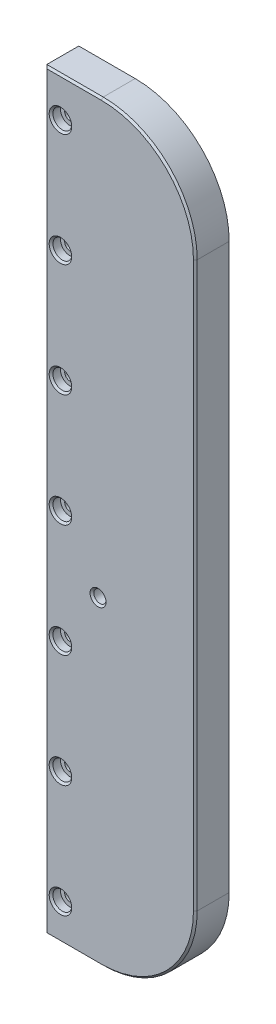
ISO-10303-21;
HEADER;
FILE_DESCRIPTION(('STEP AP214'),'2;1');
FILE_NAME('part.step','',(''),(''),'','','');
FILE_SCHEMA(('AUTOMOTIVE_DESIGN { 1 0 10303 214 1 1 1 1 }'));
ENDSEC;
DATA;
#1=APPLICATION_CONTEXT('core data for automotive mechanical design processes');
#2=APPLICATION_PROTOCOL_DEFINITION('international standard','automotive_design',2000,#1);
#3=PRODUCT_CONTEXT('',#1,'mechanical');
#4=PRODUCT('Part','Part','',(#3));
#5=PRODUCT_RELATED_PRODUCT_CATEGORY('part','',(#4));
#6=PRODUCT_DEFINITION_FORMATION('','',#4);
#7=PRODUCT_DEFINITION_CONTEXT('part definition',#1,'design');
#8=PRODUCT_DEFINITION('design','',#6,#7);
#9=PRODUCT_DEFINITION_SHAPE('','',#8);
#10=(LENGTH_UNIT() NAMED_UNIT(*) SI_UNIT(.MILLI.,.METRE.));
#11=(NAMED_UNIT(*) PLANE_ANGLE_UNIT() SI_UNIT($,.RADIAN.));
#12=(NAMED_UNIT(*) SI_UNIT($,.STERADIAN.) SOLID_ANGLE_UNIT());
#13=UNCERTAINTY_MEASURE_WITH_UNIT(LENGTH_MEASURE(1.E-05),#10,'distance_accuracy_value','');
#14=(GEOMETRIC_REPRESENTATION_CONTEXT(3) GLOBAL_UNCERTAINTY_ASSIGNED_CONTEXT((#13)) GLOBAL_UNIT_ASSIGNED_CONTEXT((#10,
#11,#12)) REPRESENTATION_CONTEXT('',''));
#15=CARTESIAN_POINT('',(0.,0.,0.));
#16=DIRECTION('',(0.,0.,1.));
#17=DIRECTION('',(1.,0.,0.));
#18=AXIS2_PLACEMENT_3D('',#15,#16,#17);
#19=CARTESIAN_POINT('',(1.00000000000003,271.,18.));
#20=DIRECTION('',(1.,0.,0.));
#21=DIRECTION('',(0.,1.,0.));
#22=AXIS2_PLACEMENT_3D('',#19,#20,#21);
#23=PLANE('',#22);
#24=DIRECTION('',(0.,0.,-1.));
#25=VECTOR('',#24,1.);
#26=CARTESIAN_POINT('',(1.00000000000008,-129.,18.));
#27=LINE('',#26,#25);
#28=CARTESIAN_POINT('',(1.00000000000008,-129.,17.0000000000001));
#29=VERTEX_POINT('',#28);
#30=CARTESIAN_POINT('',(1.00000000000008,-129.,0.));
#31=VERTEX_POINT('',#30);
#32=EDGE_CURVE('E109',#29,#31,#27,.T.);
#33=ORIENTED_EDGE('',*,*,#32,.F.);
#34=DIRECTION('',(0.,1.,0.));
#35=VECTOR('',#34,1.);
#36=CARTESIAN_POINT('',(1.00000000000003,271.,17.0000000000001));
#37=LINE('',#36,#35);
#38=CARTESIAN_POINT('',(1.00000000000003,271.,17.0000000000001));
#39=VERTEX_POINT('',#38);
#40=EDGE_CURVE('E225',#29,#39,#37,.T.);
#41=ORIENTED_EDGE('',*,*,#40,.T.);
#42=DIRECTION('',(0.,0.,-1.));
#43=VECTOR('',#42,1.);
#44=CARTESIAN_POINT('',(1.00000000000003,271.,18.));
#45=LINE('',#44,#43);
#46=CARTESIAN_POINT('',(1.00000000000003,271.,0.));
#47=VERTEX_POINT('',#46);
#48=EDGE_CURVE('E121',#39,#47,#45,.T.);
#49=ORIENTED_EDGE('',*,*,#48,.T.);
#50=DIRECTION('',(0.,-1.,0.));
#51=VECTOR('',#50,1.);
#52=CARTESIAN_POINT('',(1.00000000000003,271.,0.));
#53=LINE('',#52,#51);
#54=EDGE_CURVE('E127',#47,#31,#53,.T.);
#55=ORIENTED_EDGE('',*,*,#54,.T.);
#56=EDGE_LOOP('',(#33,#41,#49,#55));
#57=FACE_BOUND('',#56,.T.);
#58=ADVANCED_FACE('F35',(#57),#23,.F.);
#59=CARTESIAN_POINT('',(1.00000000000008,-129.,18.));
#60=DIRECTION('',(0.,1.,0.));
#61=DIRECTION('',(0.,0.,1.));
#62=AXIS2_PLACEMENT_3D('',#59,#60,#61);
#63=PLANE('',#62);
#64=DIRECTION('',(0.,0.,-1.));
#65=VECTOR('',#64,1.);
#66=CARTESIAN_POINT('',(31.0000000000001,-129.,18.));
#67=LINE('',#66,#65);
#68=CARTESIAN_POINT('',(31.0000000000001,-129.,0.));
#69=VERTEX_POINT('',#68);
#70=CARTESIAN_POINT('',(31.0000000000001,-129.,17.0000000000001));
#71=VERTEX_POINT('',#70);
#72=EDGE_CURVE('E155',#69,#71,#67,.F.);
#73=ORIENTED_EDGE('',*,*,#72,.T.);
#74=DIRECTION('',(-1.,0.,0.));
#75=VECTOR('',#74,1.);
#76=CARTESIAN_POINT('',(1.00000000000008,-129.,17.0000000000001));
#77=LINE('',#76,#75);
#78=EDGE_CURVE('E116',#71,#29,#77,.T.);
#79=ORIENTED_EDGE('',*,*,#78,.T.);
#80=ORIENTED_EDGE('',*,*,#32,.T.);
#81=DIRECTION('',(1.,0.,0.));
#82=VECTOR('',#81,1.);
#83=CARTESIAN_POINT('',(1.00000000000008,-129.,0.));
#84=LINE('',#83,#82);
#85=EDGE_CURVE('E113',#31,#69,#84,.T.);
#86=ORIENTED_EDGE('',*,*,#85,.T.);
#87=EDGE_LOOP('',(#73,#79,#80,#86));
#88=FACE_BOUND('',#87,.T.);
#89=ADVANCED_FACE('F112',(#88),#63,.F.);
#90=CARTESIAN_POINT('',(81.,271.,18.));
#91=DIRECTION('',(-1.,0.,0.));
#92=DIRECTION('',(0.,-1.,0.));
#93=AXIS2_PLACEMENT_3D('',#90,#91,#92);
#94=PLANE('',#93);
#95=DIRECTION('',(0.,0.,-1.));
#96=VECTOR('',#95,1.);
#97=CARTESIAN_POINT('',(81.,221.,18.));
#98=LINE('',#97,#96);
#99=CARTESIAN_POINT('',(81.,221.,0.));
#100=VERTEX_POINT('',#99);
#101=CARTESIAN_POINT('',(81.,221.,17.0000000000001));
#102=VERTEX_POINT('',#101);
#103=EDGE_CURVE('E153',#100,#102,#98,.F.);
#104=ORIENTED_EDGE('',*,*,#103,.T.);
#105=DIRECTION('',(0.,-1.,0.));
#106=VECTOR('',#105,1.);
#107=CARTESIAN_POINT('',(81.0000000000001,-78.9999999999998,17.0000000000001));
#108=LINE('',#107,#106);
#109=CARTESIAN_POINT('',(81.0000000000001,-78.9999999999998,17.0000000000001));
#110=VERTEX_POINT('',#109);
#111=EDGE_CURVE('E229',#102,#110,#108,.T.);
#112=ORIENTED_EDGE('',*,*,#111,.T.);
#113=DIRECTION('',(0.,0.,-1.));
#114=VECTOR('',#113,1.);
#115=CARTESIAN_POINT('',(81.0000000000001,-78.9999999999998,18.));
#116=LINE('',#115,#114);
#117=CARTESIAN_POINT('',(81.0000000000001,-78.9999999999998,0.));
#118=VERTEX_POINT('',#117);
#119=EDGE_CURVE('E151',#110,#118,#116,.T.);
#120=ORIENTED_EDGE('',*,*,#119,.T.);
#121=DIRECTION('',(0.,1.,0.));
#122=VECTOR('',#121,1.);
#123=CARTESIAN_POINT('',(81.,271.,0.));
#124=LINE('',#123,#122);
#125=EDGE_CURVE('E131',#118,#100,#124,.T.);
#126=ORIENTED_EDGE('',*,*,#125,.T.);
#127=EDGE_LOOP('',(#104,#112,#120,#126));
#128=FACE_BOUND('',#127,.T.);
#129=ADVANCED_FACE('F326',(#128),#94,.F.);
#130=CARTESIAN_POINT('',(1.00000000000003,271.,18.));
#131=DIRECTION('',(0.,-1.,0.));
#132=DIRECTION('',(0.,0.,-1.));
#133=AXIS2_PLACEMENT_3D('',#130,#131,#132);
#134=PLANE('',#133);
#135=ORIENTED_EDGE('',*,*,#48,.F.);
#136=DIRECTION('',(1.,0.,0.));
#137=VECTOR('',#136,1.);
#138=CARTESIAN_POINT('',(31.,271.,17.0000000000001));
#139=LINE('',#138,#137);
#140=CARTESIAN_POINT('',(31.,271.,17.0000000000001));
#141=VERTEX_POINT('',#140);
#142=EDGE_CURVE('E59',#39,#141,#139,.T.);
#143=ORIENTED_EDGE('',*,*,#142,.T.);
#144=DIRECTION('',(0.,0.,-1.));
#145=VECTOR('',#144,1.);
#146=CARTESIAN_POINT('',(31.,271.,18.));
#147=LINE('',#146,#145);
#148=CARTESIAN_POINT('',(31.,271.,0.));
#149=VERTEX_POINT('',#148);
#150=EDGE_CURVE('E120',#141,#149,#147,.T.);
#151=ORIENTED_EDGE('',*,*,#150,.T.);
#152=DIRECTION('',(-1.,0.,0.));
#153=VECTOR('',#152,1.);
#154=CARTESIAN_POINT('',(1.00000000000003,271.,0.));
#155=LINE('',#154,#153);
#156=EDGE_CURVE('E144',#149,#47,#155,.T.);
#157=ORIENTED_EDGE('',*,*,#156,.T.);
#158=EDGE_LOOP('',(#135,#143,#151,#157));
#159=FACE_BOUND('',#158,.T.);
#160=ADVANCED_FACE('F616',(#159),#134,.F.);
#161=CARTESIAN_POINT('',(0.,0.,18.));
#162=DIRECTION('',(0.,0.,1.));
#163=DIRECTION('',(1.,0.,0.));
#164=AXIS2_PLACEMENT_3D('',#161,#162,#163);
#165=PLANE('',#164);
#166=CARTESIAN_POINT('',(29.2499999999996,40.0000000000003,18.));
#167=DIRECTION('',(0.,0.,1.));
#168=DIRECTION('',(1.,0.,0.));
#169=AXIS2_PLACEMENT_3D('',#166,#167,#168);
#170=CIRCLE('',#169,4.24999999999998);
#171=CARTESIAN_POINT('',(33.4999999999996,40.0000000000003,18.));
#172=VERTEX_POINT('',#171);
#173=EDGE_CURVE('E11',#172,#172,#170,.F.);
#174=ORIENTED_EDGE('',*,*,#173,.T.);
#175=EDGE_LOOP('',(#174));
#176=FACE_BOUND('',#175,.T.);
#177=DIRECTION('',(1.,0.,0.));
#178=VECTOR('',#177,1.);
#179=CARTESIAN_POINT('',(31.0000000000001,-128.,18.));
#180=LINE('',#179,#178);
#181=CARTESIAN_POINT('',(2.00000000000003,-128.,18.));
#182=VERTEX_POINT('',#181);
#183=CARTESIAN_POINT('',(31.0000000000001,-128.,18.));
#184=VERTEX_POINT('',#183);
#185=EDGE_CURVE('E216',#182,#184,#180,.T.);
#186=ORIENTED_EDGE('',*,*,#185,.T.);
#187=CARTESIAN_POINT('',(31.0000000000001,-78.9999999999998,18.));
#188=DIRECTION('',(0.,0.,1.));
#189=DIRECTION('',(1.,0.,0.));
#190=AXIS2_PLACEMENT_3D('',#187,#188,#189);
#191=CIRCLE('',#190,49.);
#192=CARTESIAN_POINT('',(80.0000000000001,-78.9999999999998,18.));
#193=VERTEX_POINT('',#192);
#194=EDGE_CURVE('E218',#184,#193,#191,.T.);
#195=ORIENTED_EDGE('',*,*,#194,.T.);
#196=DIRECTION('',(0.,1.,0.));
#197=VECTOR('',#196,1.);
#198=CARTESIAN_POINT('',(80.0000000000001,221.,18.));
#199=LINE('',#198,#197);
#200=CARTESIAN_POINT('',(80.0000000000001,221.,18.));
#201=VERTEX_POINT('',#200);
#202=EDGE_CURVE('E208',#193,#201,#199,.T.);
#203=ORIENTED_EDGE('',*,*,#202,.T.);
#204=CARTESIAN_POINT('',(31.,221.,18.));
#205=DIRECTION('',(0.,0.,1.));
#206=DIRECTION('',(1.,0.,0.));
#207=AXIS2_PLACEMENT_3D('',#204,#205,#206);
#208=CIRCLE('',#207,49.);
#209=CARTESIAN_POINT('',(31.,270.,18.));
#210=VERTEX_POINT('',#209);
#211=EDGE_CURVE('E210',#201,#210,#208,.T.);
#212=ORIENTED_EDGE('',*,*,#211,.T.);
#213=DIRECTION('',(-1.,0.,0.));
#214=VECTOR('',#213,1.);
#215=CARTESIAN_POINT('',(1.00000000000003,270.,18.));
#216=LINE('',#215,#214);
#217=CARTESIAN_POINT('',(1.99999999999998,270.,18.));
#218=VERTEX_POINT('',#217);
#219=EDGE_CURVE('E212',#210,#218,#216,.T.);
#220=ORIENTED_EDGE('',*,*,#219,.T.);
#221=DIRECTION('',(0.,-1.,0.));
#222=VECTOR('',#221,1.);
#223=CARTESIAN_POINT('',(2.00000000000003,-129.,18.));
#224=LINE('',#223,#222);
#225=EDGE_CURVE('E214',#218,#182,#224,.T.);
#226=ORIENTED_EDGE('',*,*,#225,.T.);
#227=EDGE_LOOP('',(#186,#195,#203,#212,#220,#226));
#228=FACE_BOUND('',#227,.T.);
#229=CARTESIAN_POINT('',(9.24999999999879,250.,18.));
#230=DIRECTION('',(0.,0.,1.));
#231=DIRECTION('',(1.,0.,0.));
#232=AXIS2_PLACEMENT_3D('',#229,#230,#231);
#233=CIRCLE('',#232,6.00000000000001);
#234=CARTESIAN_POINT('',(15.2499999999988,250.,18.));
#235=VERTEX_POINT('',#234);
#236=EDGE_CURVE('E205',#235,#235,#233,.F.);
#237=ORIENTED_EDGE('',*,*,#236,.T.);
#238=EDGE_LOOP('',(#237));
#239=FACE_BOUND('',#238,.T.);
#240=CARTESIAN_POINT('',(9.25000000000003,-110.,18.));
#241=DIRECTION('',(0.,0.,1.));
#242=DIRECTION('',(1.,0.,0.));
#243=AXIS2_PLACEMENT_3D('',#240,#241,#242);
#244=CIRCLE('',#243,6.00000000000001);
#245=CARTESIAN_POINT('',(15.25,-110.,18.));
#246=VERTEX_POINT('',#245);
#247=EDGE_CURVE('E202',#246,#246,#244,.F.);
#248=ORIENTED_EDGE('',*,*,#247,.T.);
#249=EDGE_LOOP('',(#248));
#250=FACE_BOUND('',#249,.T.);
#251=CARTESIAN_POINT('',(9.24999999999982,-49.9999999999997,18.));
#252=DIRECTION('',(0.,0.,1.));
#253=DIRECTION('',(1.,0.,0.));
#254=AXIS2_PLACEMENT_3D('',#251,#252,#253);
#255=CIRCLE('',#254,6.00000000000001);
#256=CARTESIAN_POINT('',(15.2499999999998,-49.9999999999997,18.));
#257=VERTEX_POINT('',#256);
#258=EDGE_CURVE('E199',#257,#257,#255,.F.);
#259=ORIENTED_EDGE('',*,*,#258,.T.);
#260=EDGE_LOOP('',(#259));
#261=FACE_BOUND('',#260,.T.);
#262=CARTESIAN_POINT('',(9.24999999999962,10.0000000000003,18.));
#263=DIRECTION('',(0.,0.,1.));
#264=DIRECTION('',(1.,0.,0.));
#265=AXIS2_PLACEMENT_3D('',#262,#263,#264);
#266=CIRCLE('',#265,5.99999999999995);
#267=CARTESIAN_POINT('',(15.2499999999996,10.0000000000003,18.));
#268=VERTEX_POINT('',#267);
#269=EDGE_CURVE('E196',#268,#268,#266,.F.);
#270=ORIENTED_EDGE('',*,*,#269,.T.);
#271=EDGE_LOOP('',(#270));
#272=FACE_BOUND('',#271,.T.);
#273=CARTESIAN_POINT('',(9.24999999999941,70.0000000000003,18.));
#274=DIRECTION('',(0.,0.,1.));
#275=DIRECTION('',(1.,0.,0.));
#276=AXIS2_PLACEMENT_3D('',#273,#274,#275);
#277=CIRCLE('',#276,6.00000000000001);
#278=CARTESIAN_POINT('',(15.2499999999994,70.0000000000003,18.));
#279=VERTEX_POINT('',#278);
#280=EDGE_CURVE('E193',#279,#279,#277,.F.);
#281=ORIENTED_EDGE('',*,*,#280,.T.);
#282=EDGE_LOOP('',(#281));
#283=FACE_BOUND('',#282,.T.);
#284=CARTESIAN_POINT('',(9.2499999999992,130.,18.));
#285=DIRECTION('',(0.,0.,1.));
#286=DIRECTION('',(1.,0.,0.));
#287=AXIS2_PLACEMENT_3D('',#284,#285,#286);
#288=CIRCLE('',#287,6.00000000000001);
#289=CARTESIAN_POINT('',(15.2499999999992,130.,18.));
#290=VERTEX_POINT('',#289);
#291=EDGE_CURVE('E190',#290,#290,#288,.F.);
#292=ORIENTED_EDGE('',*,*,#291,.T.);
#293=EDGE_LOOP('',(#292));
#294=FACE_BOUND('',#293,.T.);
#295=CARTESIAN_POINT('',(9.249999999999,190.,18.));
#296=DIRECTION('',(0.,0.,1.));
#297=DIRECTION('',(1.,0.,0.));
#298=AXIS2_PLACEMENT_3D('',#295,#296,#297);
#299=CIRCLE('',#298,6.00000000000001);
#300=CARTESIAN_POINT('',(15.249999999999,190.,18.));
#301=VERTEX_POINT('',#300);
#302=EDGE_CURVE('E156',#301,#301,#299,.F.);
#303=ORIENTED_EDGE('',*,*,#302,.T.);
#304=EDGE_LOOP('',(#303));
#305=FACE_BOUND('',#304,.T.);
#306=ADVANCED_FACE('F288',(#176,#228,#239,#250,#261,#272,#283,#294,#305),#165,.T.);
#307=CARTESIAN_POINT('',(0.,0.,0.));
#308=DIRECTION('',(0.,0.,1.));
#309=DIRECTION('',(1.,0.,0.));
#310=AXIS2_PLACEMENT_3D('',#307,#308,#309);
#311=PLANE('',#310);
#312=CARTESIAN_POINT('',(29.2499999999996,40.0000000000003,0.));
#313=DIRECTION('',(0.,0.,1.));
#314=DIRECTION('',(1.,0.,0.));
#315=AXIS2_PLACEMENT_3D('',#312,#313,#314);
#316=CIRCLE('',#315,4.24999999999998);
#317=CARTESIAN_POINT('',(33.4999999999996,40.0000000000003,0.));
#318=VERTEX_POINT('',#317);
#319=EDGE_CURVE('E252',#318,#318,#316,.T.);
#320=ORIENTED_EDGE('',*,*,#319,.T.);
#321=EDGE_LOOP('',(#320));
#322=FACE_BOUND('',#321,.T.);
#323=CARTESIAN_POINT('',(9.249999999999,190.,0.));
#324=DIRECTION('',(0.,0.,1.));
#325=DIRECTION('',(1.,0.,0.));
#326=AXIS2_PLACEMENT_3D('',#323,#324,#325);
#327=CIRCLE('',#326,2.74999999999999);
#328=CARTESIAN_POINT('',(11.999999999999,190.,0.));
#329=VERTEX_POINT('',#328);
#330=EDGE_CURVE('E183',#329,#329,#327,.T.);
#331=ORIENTED_EDGE('',*,*,#330,.T.);
#332=EDGE_LOOP('',(#331));
#333=FACE_BOUND('',#332,.T.);
#334=CARTESIAN_POINT('',(9.2499999999992,130.,0.));
#335=DIRECTION('',(0.,0.,1.));
#336=DIRECTION('',(1.,0.,0.));
#337=AXIS2_PLACEMENT_3D('',#334,#335,#336);
#338=CIRCLE('',#337,2.74999999999999);
#339=CARTESIAN_POINT('',(11.9999999999992,130.,0.));
#340=VERTEX_POINT('',#339);
#341=EDGE_CURVE('E178',#340,#340,#338,.T.);
#342=ORIENTED_EDGE('',*,*,#341,.T.);
#343=EDGE_LOOP('',(#342));
#344=FACE_BOUND('',#343,.T.);
#345=CARTESIAN_POINT('',(9.24999999999941,70.0000000000003,0.));
#346=DIRECTION('',(0.,0.,1.));
#347=DIRECTION('',(1.,0.,0.));
#348=AXIS2_PLACEMENT_3D('',#345,#346,#347);
#349=CIRCLE('',#348,2.74999999999999);
#350=CARTESIAN_POINT('',(11.9999999999994,70.0000000000003,0.));
#351=VERTEX_POINT('',#350);
#352=EDGE_CURVE('E173',#351,#351,#349,.T.);
#353=ORIENTED_EDGE('',*,*,#352,.T.);
#354=EDGE_LOOP('',(#353));
#355=FACE_BOUND('',#354,.T.);
#356=CARTESIAN_POINT('',(9.24999999999962,10.0000000000003,0.));
#357=DIRECTION('',(0.,0.,1.));
#358=DIRECTION('',(1.,0.,0.));
#359=AXIS2_PLACEMENT_3D('',#356,#357,#358);
#360=CIRCLE('',#359,2.74999999999999);
#361=CARTESIAN_POINT('',(11.9999999999996,10.0000000000003,0.));
#362=VERTEX_POINT('',#361);
#363=EDGE_CURVE('E168',#362,#362,#360,.T.);
#364=ORIENTED_EDGE('',*,*,#363,.T.);
#365=EDGE_LOOP('',(#364));
#366=FACE_BOUND('',#365,.T.);
#367=CARTESIAN_POINT('',(9.24999999999982,-49.9999999999997,0.));
#368=DIRECTION('',(0.,0.,1.));
#369=DIRECTION('',(1.,0.,0.));
#370=AXIS2_PLACEMENT_3D('',#367,#368,#369);
#371=CIRCLE('',#370,2.74999999999999);
#372=CARTESIAN_POINT('',(11.9999999999998,-49.9999999999997,0.));
#373=VERTEX_POINT('',#372);
#374=EDGE_CURVE('E163',#373,#373,#371,.T.);
#375=ORIENTED_EDGE('',*,*,#374,.T.);
#376=EDGE_LOOP('',(#375));
#377=FACE_BOUND('',#376,.T.);
#378=CARTESIAN_POINT('',(9.25000000000003,-110.,0.));
#379=DIRECTION('',(0.,0.,1.));
#380=DIRECTION('',(1.,0.,0.));
#381=AXIS2_PLACEMENT_3D('',#378,#379,#380);
#382=CIRCLE('',#381,2.74999999999999);
#383=CARTESIAN_POINT('',(12.,-110.,0.));
#384=VERTEX_POINT('',#383);
#385=EDGE_CURVE('E158',#384,#384,#382,.T.);
#386=ORIENTED_EDGE('',*,*,#385,.T.);
#387=EDGE_LOOP('',(#386));
#388=FACE_BOUND('',#387,.T.);
#389=CARTESIAN_POINT('',(9.24999999999879,250.,0.));
#390=DIRECTION('',(0.,0.,1.));
#391=DIRECTION('',(1.,0.,0.));
#392=AXIS2_PLACEMENT_3D('',#389,#390,#391);
#393=CIRCLE('',#392,2.74999999999999);
#394=CARTESIAN_POINT('',(11.9999999999988,250.,0.));
#395=VERTEX_POINT('',#394);
#396=EDGE_CURVE('E134',#395,#395,#393,.T.);
#397=ORIENTED_EDGE('',*,*,#396,.T.);
#398=EDGE_LOOP('',(#397));
#399=FACE_BOUND('',#398,.T.);
#400=ORIENTED_EDGE('',*,*,#156,.F.);
#401=CARTESIAN_POINT('',(31.,221.,0.));
#402=DIRECTION('',(0.,0.,1.));
#403=DIRECTION('',(1.,0.,0.));
#404=AXIS2_PLACEMENT_3D('',#401,#402,#403);
#405=CIRCLE('',#404,50.);
#406=EDGE_CURVE('E149',#149,#100,#405,.F.);
#407=ORIENTED_EDGE('',*,*,#406,.T.);
#408=ORIENTED_EDGE('',*,*,#125,.F.);
#409=CARTESIAN_POINT('',(31.0000000000001,-78.9999999999998,0.));
#410=DIRECTION('',(0.,0.,1.));
#411=DIRECTION('',(1.,0.,0.));
#412=AXIS2_PLACEMENT_3D('',#409,#410,#411);
#413=CIRCLE('',#412,50.);
#414=EDGE_CURVE('E130',#118,#69,#413,.F.);
#415=ORIENTED_EDGE('',*,*,#414,.T.);
#416=ORIENTED_EDGE('',*,*,#85,.F.);
#417=ORIENTED_EDGE('',*,*,#54,.F.);
#418=EDGE_LOOP('',(#400,#407,#408,#415,#416,#417));
#419=FACE_BOUND('',#418,.T.);
#420=ADVANCED_FACE('F126',(#322,#333,#344,#355,#366,#377,#388,#399,#419),#311,.F.);
#421=CARTESIAN_POINT('',(31.,221.,18.));
#422=DIRECTION('',(0.,0.,-1.));
#423=DIRECTION('',(-1.,0.,0.));
#424=AXIS2_PLACEMENT_3D('',#421,#422,#423);
#425=CYLINDRICAL_SURFACE('',#424,50.);
#426=ORIENTED_EDGE('',*,*,#150,.F.);
#427=CARTESIAN_POINT('',(31.,221.,17.0000000000001));
#428=DIRECTION('',(0.,0.,1.));
#429=DIRECTION('',(1.,0.,0.));
#430=AXIS2_PLACEMENT_3D('',#427,#428,#429);
#431=CIRCLE('',#430,50.);
#432=EDGE_CURVE('E51',#141,#102,#431,.F.);
#433=ORIENTED_EDGE('',*,*,#432,.T.);
#434=ORIENTED_EDGE('',*,*,#103,.F.);
#435=ORIENTED_EDGE('',*,*,#406,.F.);
#436=EDGE_LOOP('',(#426,#433,#434,#435));
#437=FACE_BOUND('',#436,.T.);
#438=ADVANCED_FACE('F287',(#437),#425,.T.);
#439=CARTESIAN_POINT('',(31.0000000000001,-78.9999999999998,18.));
#440=DIRECTION('',(0.,0.,-1.));
#441=DIRECTION('',(-1.,0.,0.));
#442=AXIS2_PLACEMENT_3D('',#439,#440,#441);
#443=CYLINDRICAL_SURFACE('',#442,50.);
#444=ORIENTED_EDGE('',*,*,#119,.F.);
#445=CARTESIAN_POINT('',(31.0000000000001,-78.9999999999998,17.0000000000001));
#446=DIRECTION('',(0.,0.,1.));
#447=DIRECTION('',(1.,0.,0.));
#448=AXIS2_PLACEMENT_3D('',#445,#446,#447);
#449=CIRCLE('',#448,50.);
#450=EDGE_CURVE('E221',#110,#71,#449,.F.);
#451=ORIENTED_EDGE('',*,*,#450,.T.);
#452=ORIENTED_EDGE('',*,*,#72,.F.);
#453=ORIENTED_EDGE('',*,*,#414,.F.);
#454=EDGE_LOOP('',(#444,#451,#452,#453));
#455=FACE_BOUND('',#454,.T.);
#456=ADVANCED_FACE('F307',(#455),#443,.T.);
#457=CARTESIAN_POINT('',(9.24999999999879,250.,18.));
#458=DIRECTION('',(0.,0.,1.));
#459=DIRECTION('',(1.,0.,0.));
#460=AXIS2_PLACEMENT_3D('',#457,#458,#459);
#461=CYLINDRICAL_SURFACE('',#460,2.74999999999999);
#462=CARTESIAN_POINT('',(9.24999999999879,250.,13.));
#463=DIRECTION('',(0.,0.,1.));
#464=DIRECTION('',(1.,0.,0.));
#465=AXIS2_PLACEMENT_3D('',#462,#463,#464);
#466=CIRCLE('',#465,2.75);
#467=CARTESIAN_POINT('',(11.9999999999988,250.,13.));
#468=VERTEX_POINT('',#467);
#469=EDGE_CURVE('E137',#468,#468,#466,.T.);
#470=ORIENTED_EDGE('',*,*,#469,.T.);
#471=EDGE_LOOP('',(#470));
#472=FACE_BOUND('',#471,.T.);
#473=ORIENTED_EDGE('',*,*,#396,.F.);
#474=EDGE_LOOP('',(#473));
#475=FACE_BOUND('',#474,.T.);
#476=ADVANCED_FACE('F304',(#472,#475),#461,.F.);
#477=CARTESIAN_POINT('',(11.9999999999988,250.,13.));
#478=DIRECTION('',(0.,0.,-1.));
#479=DIRECTION('',(-1.,0.,0.));
#480=AXIS2_PLACEMENT_3D('',#477,#478,#479);
#481=PLANE('',#480);
#482=ORIENTED_EDGE('',*,*,#469,.F.);
#483=EDGE_LOOP('',(#482));
#484=FACE_BOUND('',#483,.T.);
#485=CARTESIAN_POINT('',(9.24999999999879,250.,13.));
#486=DIRECTION('',(0.,0.,1.));
#487=DIRECTION('',(1.,0.,0.));
#488=AXIS2_PLACEMENT_3D('',#485,#486,#487);
#489=CIRCLE('',#488,5.);
#490=CARTESIAN_POINT('',(14.2499999999988,250.,13.));
#491=VERTEX_POINT('',#490);
#492=EDGE_CURVE('E161',#491,#491,#489,.T.);
#493=ORIENTED_EDGE('',*,*,#492,.T.);
#494=EDGE_LOOP('',(#493));
#495=FACE_BOUND('',#494,.T.);
#496=ADVANCED_FACE('F306',(#484,#495),#481,.F.);
#497=CARTESIAN_POINT('',(9.24999999999879,250.,18.));
#498=DIRECTION('',(0.,0.,1.));
#499=DIRECTION('',(1.,0.,0.));
#500=AXIS2_PLACEMENT_3D('',#497,#498,#499);
#501=CYLINDRICAL_SURFACE('',#500,5.);
#502=CARTESIAN_POINT('',(9.24999999999879,250.,17.));
#503=DIRECTION('',(0.,0.,1.));
#504=DIRECTION('',(1.,0.,0.));
#505=AXIS2_PLACEMENT_3D('',#502,#503,#504);
#506=CIRCLE('',#505,5.);
#507=CARTESIAN_POINT('',(14.2499999999988,250.,17.));
#508=VERTEX_POINT('',#507);
#509=EDGE_CURVE('E231',#508,#508,#506,.T.);
#510=ORIENTED_EDGE('',*,*,#509,.T.);
#511=EDGE_LOOP('',(#510));
#512=FACE_BOUND('',#511,.T.);
#513=ORIENTED_EDGE('',*,*,#492,.F.);
#514=EDGE_LOOP('',(#513));
#515=FACE_BOUND('',#514,.T.);
#516=ADVANCED_FACE('F314',(#512,#515),#501,.F.);
#517=CARTESIAN_POINT('',(9.25000000000003,-110.,18.));
#518=DIRECTION('',(0.,0.,1.));
#519=DIRECTION('',(1.,0.,0.));
#520=AXIS2_PLACEMENT_3D('',#517,#518,#519);
#521=CYLINDRICAL_SURFACE('',#520,2.74999999999999);
#522=CARTESIAN_POINT('',(9.25000000000003,-110.,13.));
#523=DIRECTION('',(0.,0.,1.));
#524=DIRECTION('',(1.,0.,0.));
#525=AXIS2_PLACEMENT_3D('',#522,#523,#524);
#526=CIRCLE('',#525,2.75);
#527=CARTESIAN_POINT('',(12.,-110.,13.));
#528=VERTEX_POINT('',#527);
#529=EDGE_CURVE('E162',#528,#528,#526,.T.);
#530=ORIENTED_EDGE('',*,*,#529,.T.);
#531=EDGE_LOOP('',(#530));
#532=FACE_BOUND('',#531,.T.);
#533=ORIENTED_EDGE('',*,*,#385,.F.);
#534=EDGE_LOOP('',(#533));
#535=FACE_BOUND('',#534,.T.);
#536=ADVANCED_FACE('F472',(#532,#535),#521,.F.);
#537=CARTESIAN_POINT('',(12.,-110.,13.));
#538=DIRECTION('',(0.,0.,-1.));
#539=DIRECTION('',(-1.,0.,0.));
#540=AXIS2_PLACEMENT_3D('',#537,#538,#539);
#541=PLANE('',#540);
#542=ORIENTED_EDGE('',*,*,#529,.F.);
#543=EDGE_LOOP('',(#542));
#544=FACE_BOUND('',#543,.T.);
#545=CARTESIAN_POINT('',(9.25000000000003,-110.,13.));
#546=DIRECTION('',(0.,0.,1.));
#547=DIRECTION('',(1.,0.,0.));
#548=AXIS2_PLACEMENT_3D('',#545,#546,#547);
#549=CIRCLE('',#548,5.);
#550=CARTESIAN_POINT('',(14.25,-110.,13.));
#551=VERTEX_POINT('',#550);
#552=EDGE_CURVE('E166',#551,#551,#549,.T.);
#553=ORIENTED_EDGE('',*,*,#552,.T.);
#554=EDGE_LOOP('',(#553));
#555=FACE_BOUND('',#554,.T.);
#556=ADVANCED_FACE('F478',(#544,#555),#541,.F.);
#557=CARTESIAN_POINT('',(9.25000000000003,-110.,18.));
#558=DIRECTION('',(0.,0.,1.));
#559=DIRECTION('',(1.,0.,0.));
#560=AXIS2_PLACEMENT_3D('',#557,#558,#559);
#561=CYLINDRICAL_SURFACE('',#560,5.);
#562=CARTESIAN_POINT('',(9.25000000000003,-110.,17.));
#563=DIRECTION('',(0.,0.,1.));
#564=DIRECTION('',(1.,0.,0.));
#565=AXIS2_PLACEMENT_3D('',#562,#563,#564);
#566=CIRCLE('',#565,5.);
#567=CARTESIAN_POINT('',(14.25,-110.,17.));
#568=VERTEX_POINT('',#567);
#569=EDGE_CURVE('E234',#568,#568,#566,.T.);
#570=ORIENTED_EDGE('',*,*,#569,.T.);
#571=EDGE_LOOP('',(#570));
#572=FACE_BOUND('',#571,.T.);
#573=ORIENTED_EDGE('',*,*,#552,.F.);
#574=EDGE_LOOP('',(#573));
#575=FACE_BOUND('',#574,.T.);
#576=ADVANCED_FACE('F484',(#572,#575),#561,.F.);
#577=CARTESIAN_POINT('',(9.24999999999982,-49.9999999999997,18.));
#578=DIRECTION('',(0.,0.,1.));
#579=DIRECTION('',(1.,0.,0.));
#580=AXIS2_PLACEMENT_3D('',#577,#578,#579);
#581=CYLINDRICAL_SURFACE('',#580,2.74999999999999);
#582=CARTESIAN_POINT('',(9.24999999999982,-49.9999999999997,13.));
#583=DIRECTION('',(0.,0.,1.));
#584=DIRECTION('',(1.,0.,0.));
#585=AXIS2_PLACEMENT_3D('',#582,#583,#584);
#586=CIRCLE('',#585,2.75);
#587=CARTESIAN_POINT('',(11.9999999999998,-49.9999999999997,13.));
#588=VERTEX_POINT('',#587);
#589=EDGE_CURVE('E167',#588,#588,#586,.T.);
#590=ORIENTED_EDGE('',*,*,#589,.T.);
#591=EDGE_LOOP('',(#590));
#592=FACE_BOUND('',#591,.T.);
#593=ORIENTED_EDGE('',*,*,#374,.F.);
#594=EDGE_LOOP('',(#593));
#595=FACE_BOUND('',#594,.T.);
#596=ADVANCED_FACE('F488',(#592,#595),#581,.F.);
#597=CARTESIAN_POINT('',(11.9999999999998,-49.9999999999997,13.));
#598=DIRECTION('',(0.,0.,-1.));
#599=DIRECTION('',(-1.,0.,0.));
#600=AXIS2_PLACEMENT_3D('',#597,#598,#599);
#601=PLANE('',#600);
#602=ORIENTED_EDGE('',*,*,#589,.F.);
#603=EDGE_LOOP('',(#602));
#604=FACE_BOUND('',#603,.T.);
#605=CARTESIAN_POINT('',(9.24999999999982,-49.9999999999997,13.));
#606=DIRECTION('',(0.,0.,1.));
#607=DIRECTION('',(1.,0.,0.));
#608=AXIS2_PLACEMENT_3D('',#605,#606,#607);
#609=CIRCLE('',#608,5.);
#610=CARTESIAN_POINT('',(14.2499999999998,-49.9999999999997,13.));
#611=VERTEX_POINT('',#610);
#612=EDGE_CURVE('E171',#611,#611,#609,.T.);
#613=ORIENTED_EDGE('',*,*,#612,.T.);
#614=EDGE_LOOP('',(#613));
#615=FACE_BOUND('',#614,.T.);
#616=ADVANCED_FACE('F492',(#604,#615),#601,.F.);
#617=CARTESIAN_POINT('',(9.24999999999982,-49.9999999999997,18.));
#618=DIRECTION('',(0.,0.,1.));
#619=DIRECTION('',(1.,0.,0.));
#620=AXIS2_PLACEMENT_3D('',#617,#618,#619);
#621=CYLINDRICAL_SURFACE('',#620,5.);
#622=CARTESIAN_POINT('',(9.24999999999982,-49.9999999999997,17.));
#623=DIRECTION('',(0.,0.,1.));
#624=DIRECTION('',(1.,0.,0.));
#625=AXIS2_PLACEMENT_3D('',#622,#623,#624);
#626=CIRCLE('',#625,5.);
#627=CARTESIAN_POINT('',(14.2499999999998,-49.9999999999997,17.));
#628=VERTEX_POINT('',#627);
#629=EDGE_CURVE('E237',#628,#628,#626,.T.);
#630=ORIENTED_EDGE('',*,*,#629,.T.);
#631=EDGE_LOOP('',(#630));
#632=FACE_BOUND('',#631,.T.);
#633=ORIENTED_EDGE('',*,*,#612,.F.);
#634=EDGE_LOOP('',(#633));
#635=FACE_BOUND('',#634,.T.);
#636=ADVANCED_FACE('F496',(#632,#635),#621,.F.);
#637=CARTESIAN_POINT('',(9.24999999999962,10.0000000000003,18.));
#638=DIRECTION('',(0.,0.,1.));
#639=DIRECTION('',(1.,0.,0.));
#640=AXIS2_PLACEMENT_3D('',#637,#638,#639);
#641=CYLINDRICAL_SURFACE('',#640,2.74999999999999);
#642=CARTESIAN_POINT('',(9.24999999999962,10.0000000000003,13.));
#643=DIRECTION('',(0.,0.,1.));
#644=DIRECTION('',(1.,0.,0.));
#645=AXIS2_PLACEMENT_3D('',#642,#643,#644);
#646=CIRCLE('',#645,2.75);
#647=CARTESIAN_POINT('',(11.9999999999996,10.0000000000003,13.));
#648=VERTEX_POINT('',#647);
#649=EDGE_CURVE('E172',#648,#648,#646,.T.);
#650=ORIENTED_EDGE('',*,*,#649,.T.);
#651=EDGE_LOOP('',(#650));
#652=FACE_BOUND('',#651,.T.);
#653=ORIENTED_EDGE('',*,*,#363,.F.);
#654=EDGE_LOOP('',(#653));
#655=FACE_BOUND('',#654,.T.);
#656=ADVANCED_FACE('F500',(#652,#655),#641,.F.);
#657=CARTESIAN_POINT('',(11.9999999999996,10.0000000000003,13.));
#658=DIRECTION('',(0.,0.,-1.));
#659=DIRECTION('',(-1.,0.,0.));
#660=AXIS2_PLACEMENT_3D('',#657,#658,#659);
#661=PLANE('',#660);
#662=ORIENTED_EDGE('',*,*,#649,.F.);
#663=EDGE_LOOP('',(#662));
#664=FACE_BOUND('',#663,.T.);
#665=CARTESIAN_POINT('',(9.24999999999962,10.0000000000003,13.));
#666=DIRECTION('',(0.,0.,1.));
#667=DIRECTION('',(1.,0.,0.));
#668=AXIS2_PLACEMENT_3D('',#665,#666,#667);
#669=CIRCLE('',#668,5.);
#670=CARTESIAN_POINT('',(14.2499999999996,10.0000000000003,13.));
#671=VERTEX_POINT('',#670);
#672=EDGE_CURVE('E176',#671,#671,#669,.T.);
#673=ORIENTED_EDGE('',*,*,#672,.T.);
#674=EDGE_LOOP('',(#673));
#675=FACE_BOUND('',#674,.T.);
#676=ADVANCED_FACE('F504',(#664,#675),#661,.F.);
#677=CARTESIAN_POINT('',(9.24999999999962,10.0000000000003,18.));
#678=DIRECTION('',(0.,0.,1.));
#679=DIRECTION('',(1.,0.,0.));
#680=AXIS2_PLACEMENT_3D('',#677,#678,#679);
#681=CYLINDRICAL_SURFACE('',#680,5.);
#682=CARTESIAN_POINT('',(9.24999999999962,10.0000000000003,17.0000000000001));
#683=DIRECTION('',(0.,0.,1.));
#684=DIRECTION('',(1.,0.,0.));
#685=AXIS2_PLACEMENT_3D('',#682,#683,#684);
#686=CIRCLE('',#685,5.);
#687=CARTESIAN_POINT('',(14.2499999999996,10.0000000000003,17.0000000000001));
#688=VERTEX_POINT('',#687);
#689=EDGE_CURVE('E240',#688,#688,#686,.T.);
#690=ORIENTED_EDGE('',*,*,#689,.T.);
#691=EDGE_LOOP('',(#690));
#692=FACE_BOUND('',#691,.T.);
#693=ORIENTED_EDGE('',*,*,#672,.F.);
#694=EDGE_LOOP('',(#693));
#695=FACE_BOUND('',#694,.T.);
#696=ADVANCED_FACE('F508',(#692,#695),#681,.F.);
#697=CARTESIAN_POINT('',(9.24999999999941,70.0000000000003,18.));
#698=DIRECTION('',(0.,0.,1.));
#699=DIRECTION('',(1.,0.,0.));
#700=AXIS2_PLACEMENT_3D('',#697,#698,#699);
#701=CYLINDRICAL_SURFACE('',#700,2.74999999999999);
#702=CARTESIAN_POINT('',(9.24999999999941,70.0000000000003,13.));
#703=DIRECTION('',(0.,0.,1.));
#704=DIRECTION('',(1.,0.,0.));
#705=AXIS2_PLACEMENT_3D('',#702,#703,#704);
#706=CIRCLE('',#705,2.75);
#707=CARTESIAN_POINT('',(11.9999999999994,70.0000000000003,13.));
#708=VERTEX_POINT('',#707);
#709=EDGE_CURVE('E177',#708,#708,#706,.T.);
#710=ORIENTED_EDGE('',*,*,#709,.T.);
#711=EDGE_LOOP('',(#710));
#712=FACE_BOUND('',#711,.T.);
#713=ORIENTED_EDGE('',*,*,#352,.F.);
#714=EDGE_LOOP('',(#713));
#715=FACE_BOUND('',#714,.T.);
#716=ADVANCED_FACE('F512',(#712,#715),#701,.F.);
#717=CARTESIAN_POINT('',(11.9999999999994,70.0000000000003,13.));
#718=DIRECTION('',(0.,0.,-1.));
#719=DIRECTION('',(-1.,0.,0.));
#720=AXIS2_PLACEMENT_3D('',#717,#718,#719);
#721=PLANE('',#720);
#722=ORIENTED_EDGE('',*,*,#709,.F.);
#723=EDGE_LOOP('',(#722));
#724=FACE_BOUND('',#723,.T.);
#725=CARTESIAN_POINT('',(9.24999999999941,70.0000000000003,13.));
#726=DIRECTION('',(0.,0.,1.));
#727=DIRECTION('',(1.,0.,0.));
#728=AXIS2_PLACEMENT_3D('',#725,#726,#727);
#729=CIRCLE('',#728,5.);
#730=CARTESIAN_POINT('',(14.2499999999994,70.0000000000003,13.));
#731=VERTEX_POINT('',#730);
#732=EDGE_CURVE('E181',#731,#731,#729,.T.);
#733=ORIENTED_EDGE('',*,*,#732,.T.);
#734=EDGE_LOOP('',(#733));
#735=FACE_BOUND('',#734,.T.);
#736=ADVANCED_FACE('F516',(#724,#735),#721,.F.);
#737=CARTESIAN_POINT('',(9.24999999999941,70.0000000000003,18.));
#738=DIRECTION('',(0.,0.,1.));
#739=DIRECTION('',(1.,0.,0.));
#740=AXIS2_PLACEMENT_3D('',#737,#738,#739);
#741=CYLINDRICAL_SURFACE('',#740,5.);
#742=CARTESIAN_POINT('',(9.24999999999941,70.0000000000003,17.));
#743=DIRECTION('',(0.,0.,1.));
#744=DIRECTION('',(1.,0.,0.));
#745=AXIS2_PLACEMENT_3D('',#742,#743,#744);
#746=CIRCLE('',#745,5.);
#747=CARTESIAN_POINT('',(14.2499999999994,70.0000000000003,17.));
#748=VERTEX_POINT('',#747);
#749=EDGE_CURVE('E243',#748,#748,#746,.T.);
#750=ORIENTED_EDGE('',*,*,#749,.T.);
#751=EDGE_LOOP('',(#750));
#752=FACE_BOUND('',#751,.T.);
#753=ORIENTED_EDGE('',*,*,#732,.F.);
#754=EDGE_LOOP('',(#753));
#755=FACE_BOUND('',#754,.T.);
#756=ADVANCED_FACE('F520',(#752,#755),#741,.F.);
#757=CARTESIAN_POINT('',(9.2499999999992,130.,18.));
#758=DIRECTION('',(0.,0.,1.));
#759=DIRECTION('',(1.,0.,0.));
#760=AXIS2_PLACEMENT_3D('',#757,#758,#759);
#761=CYLINDRICAL_SURFACE('',#760,2.74999999999999);
#762=CARTESIAN_POINT('',(9.2499999999992,130.,13.));
#763=DIRECTION('',(0.,0.,1.));
#764=DIRECTION('',(1.,0.,0.));
#765=AXIS2_PLACEMENT_3D('',#762,#763,#764);
#766=CIRCLE('',#765,2.75);
#767=CARTESIAN_POINT('',(11.9999999999992,130.,13.));
#768=VERTEX_POINT('',#767);
#769=EDGE_CURVE('E182',#768,#768,#766,.T.);
#770=ORIENTED_EDGE('',*,*,#769,.T.);
#771=EDGE_LOOP('',(#770));
#772=FACE_BOUND('',#771,.T.);
#773=ORIENTED_EDGE('',*,*,#341,.F.);
#774=EDGE_LOOP('',(#773));
#775=FACE_BOUND('',#774,.T.);
#776=ADVANCED_FACE('F524',(#772,#775),#761,.F.);
#777=CARTESIAN_POINT('',(11.9999999999992,130.,13.));
#778=DIRECTION('',(0.,0.,-1.));
#779=DIRECTION('',(-1.,0.,0.));
#780=AXIS2_PLACEMENT_3D('',#777,#778,#779);
#781=PLANE('',#780);
#782=ORIENTED_EDGE('',*,*,#769,.F.);
#783=EDGE_LOOP('',(#782));
#784=FACE_BOUND('',#783,.T.);
#785=CARTESIAN_POINT('',(9.2499999999992,130.,13.));
#786=DIRECTION('',(0.,0.,1.));
#787=DIRECTION('',(1.,0.,0.));
#788=AXIS2_PLACEMENT_3D('',#785,#786,#787);
#789=CIRCLE('',#788,5.);
#790=CARTESIAN_POINT('',(14.2499999999992,130.,13.));
#791=VERTEX_POINT('',#790);
#792=EDGE_CURVE('E186',#791,#791,#789,.T.);
#793=ORIENTED_EDGE('',*,*,#792,.T.);
#794=EDGE_LOOP('',(#793));
#795=FACE_BOUND('',#794,.T.);
#796=ADVANCED_FACE('F528',(#784,#795),#781,.F.);
#797=CARTESIAN_POINT('',(9.2499999999992,130.,18.));
#798=DIRECTION('',(0.,0.,1.));
#799=DIRECTION('',(1.,0.,0.));
#800=AXIS2_PLACEMENT_3D('',#797,#798,#799);
#801=CYLINDRICAL_SURFACE('',#800,5.);
#802=CARTESIAN_POINT('',(9.2499999999992,130.,17.));
#803=DIRECTION('',(0.,0.,1.));
#804=DIRECTION('',(1.,0.,0.));
#805=AXIS2_PLACEMENT_3D('',#802,#803,#804);
#806=CIRCLE('',#805,5.);
#807=CARTESIAN_POINT('',(14.2499999999992,130.,17.));
#808=VERTEX_POINT('',#807);
#809=EDGE_CURVE('E246',#808,#808,#806,.T.);
#810=ORIENTED_EDGE('',*,*,#809,.T.);
#811=EDGE_LOOP('',(#810));
#812=FACE_BOUND('',#811,.T.);
#813=ORIENTED_EDGE('',*,*,#792,.F.);
#814=EDGE_LOOP('',(#813));
#815=FACE_BOUND('',#814,.T.);
#816=ADVANCED_FACE('F532',(#812,#815),#801,.F.);
#817=CARTESIAN_POINT('',(9.249999999999,190.,18.));
#818=DIRECTION('',(0.,0.,1.));
#819=DIRECTION('',(1.,0.,0.));
#820=AXIS2_PLACEMENT_3D('',#817,#818,#819);
#821=CYLINDRICAL_SURFACE('',#820,2.74999999999999);
#822=CARTESIAN_POINT('',(9.249999999999,190.,13.));
#823=DIRECTION('',(0.,0.,1.));
#824=DIRECTION('',(1.,0.,0.));
#825=AXIS2_PLACEMENT_3D('',#822,#823,#824);
#826=CIRCLE('',#825,2.75);
#827=CARTESIAN_POINT('',(11.999999999999,190.,13.));
#828=VERTEX_POINT('',#827);
#829=EDGE_CURVE('E187',#828,#828,#826,.T.);
#830=ORIENTED_EDGE('',*,*,#829,.T.);
#831=EDGE_LOOP('',(#830));
#832=FACE_BOUND('',#831,.T.);
#833=ORIENTED_EDGE('',*,*,#330,.F.);
#834=EDGE_LOOP('',(#833));
#835=FACE_BOUND('',#834,.T.);
#836=ADVANCED_FACE('F536',(#832,#835),#821,.F.);
#837=CARTESIAN_POINT('',(11.999999999999,190.,13.));
#838=DIRECTION('',(0.,0.,-1.));
#839=DIRECTION('',(-1.,0.,0.));
#840=AXIS2_PLACEMENT_3D('',#837,#838,#839);
#841=PLANE('',#840);
#842=ORIENTED_EDGE('',*,*,#829,.F.);
#843=EDGE_LOOP('',(#842));
#844=FACE_BOUND('',#843,.T.);
#845=CARTESIAN_POINT('',(9.249999999999,190.,13.));
#846=DIRECTION('',(0.,0.,1.));
#847=DIRECTION('',(1.,0.,0.));
#848=AXIS2_PLACEMENT_3D('',#845,#846,#847);
#849=CIRCLE('',#848,5.);
#850=CARTESIAN_POINT('',(14.249999999999,190.,13.));
#851=VERTEX_POINT('',#850);
#852=EDGE_CURVE('E269',#851,#851,#849,.T.);
#853=ORIENTED_EDGE('',*,*,#852,.T.);
#854=EDGE_LOOP('',(#853));
#855=FACE_BOUND('',#854,.T.);
#856=ADVANCED_FACE('F438',(#844,#855),#841,.F.);
#857=CARTESIAN_POINT('',(9.249999999999,190.,18.));
#858=DIRECTION('',(0.,0.,1.));
#859=DIRECTION('',(1.,0.,0.));
#860=AXIS2_PLACEMENT_3D('',#857,#858,#859);
#861=CYLINDRICAL_SURFACE('',#860,5.);
#862=CARTESIAN_POINT('',(9.249999999999,190.,17.));
#863=DIRECTION('',(0.,0.,1.));
#864=DIRECTION('',(1.,0.,0.));
#865=AXIS2_PLACEMENT_3D('',#862,#863,#864);
#866=CIRCLE('',#865,5.);
#867=CARTESIAN_POINT('',(14.249999999999,190.,17.));
#868=VERTEX_POINT('',#867);
#869=EDGE_CURVE('E249',#868,#868,#866,.T.);
#870=ORIENTED_EDGE('',*,*,#869,.T.);
#871=EDGE_LOOP('',(#870));
#872=FACE_BOUND('',#871,.T.);
#873=ORIENTED_EDGE('',*,*,#852,.F.);
#874=EDGE_LOOP('',(#873));
#875=FACE_BOUND('',#874,.T.);
#876=ADVANCED_FACE('F375',(#872,#875),#861,.F.);
#877=CARTESIAN_POINT('',(0.,270.,18.));
#878=DIRECTION('',(0.,0.707106781186547,0.707106781186547));
#879=DIRECTION('',(1.,0.,0.));
#880=AXIS2_PLACEMENT_3D('',#877,#878,#879);
#881=PLANE('',#880);
#882=DIRECTION('',(0.,-0.707106781186547,0.707106781186547));
#883=VECTOR('',#882,1.);
#884=CARTESIAN_POINT('',(31.,271.,17.0000000000001));
#885=LINE('',#884,#883);
#886=EDGE_CURVE('E263',#141,#210,#885,.T.);
#887=ORIENTED_EDGE('',*,*,#886,.F.);
#888=ORIENTED_EDGE('',*,*,#142,.F.);
#889=DIRECTION('',(0.577350269189626,-0.577350269189626,0.577350269189626));
#890=VECTOR('',#889,1.);
#891=CARTESIAN_POINT('',(1.33333333333332,270.666666666667,17.3333333333333));
#892=LINE('',#891,#890);
#893=EDGE_CURVE('E266',#218,#39,#892,.F.);
#894=ORIENTED_EDGE('',*,*,#893,.F.);
#895=ORIENTED_EDGE('',*,*,#219,.F.);
#896=EDGE_LOOP('',(#887,#888,#894,#895));
#897=FACE_BOUND('',#896,.T.);
#898=ADVANCED_FACE('F369',(#897),#881,.T.);
#899=CARTESIAN_POINT('',(2.00000000000001,0.,18.));
#900=DIRECTION('',(-0.707106781186547,0.,0.707106781186547));
#901=DIRECTION('',(0.,1.,0.));
#902=AXIS2_PLACEMENT_3D('',#899,#900,#901);
#903=PLANE('',#902);
#904=ORIENTED_EDGE('',*,*,#893,.T.);
#905=ORIENTED_EDGE('',*,*,#40,.F.);
#906=DIRECTION('',(0.577350269189626,0.577350269189626,0.577350269189626));
#907=VECTOR('',#906,1.);
#908=CARTESIAN_POINT('',(44.6666666666666,-85.3333333333333,60.6666666666666));
#909=LINE('',#908,#907);
#910=EDGE_CURVE('E260',#182,#29,#909,.F.);
#911=ORIENTED_EDGE('',*,*,#910,.F.);
#912=ORIENTED_EDGE('',*,*,#225,.F.);
#913=EDGE_LOOP('',(#904,#905,#911,#912));
#914=FACE_BOUND('',#913,.T.);
#915=ADVANCED_FACE('F362',(#914),#903,.T.);
#916=CARTESIAN_POINT('',(31.,221.,18.));
#917=DIRECTION('',(0.,0.,-1.));
#918=DIRECTION('',(-1.,0.,0.));
#919=AXIS2_PLACEMENT_3D('',#916,#917,#918);
#920=CONICAL_SURFACE('',#919,49.,0.785398163397452);
#921=ORIENTED_EDGE('',*,*,#886,.T.);
#922=ORIENTED_EDGE('',*,*,#211,.F.);
#923=DIRECTION('',(-0.707106781186547,0.,0.707106781186547));
#924=VECTOR('',#923,1.);
#925=CARTESIAN_POINT('',(81.,221.,17.0000000000001));
#926=LINE('',#925,#924);
#927=EDGE_CURVE('E257',#102,#201,#926,.T.);
#928=ORIENTED_EDGE('',*,*,#927,.F.);
#929=ORIENTED_EDGE('',*,*,#432,.F.);
#930=EDGE_LOOP('',(#921,#922,#928,#929));
#931=FACE_BOUND('',#930,.T.);
#932=ADVANCED_FACE('F355',(#931),#920,.T.);
#933=CARTESIAN_POINT('',(0.,-128.,18.));
#934=DIRECTION('',(0.,-0.707106781186547,0.707106781186547));
#935=DIRECTION('',(-1.,0.,0.));
#936=AXIS2_PLACEMENT_3D('',#933,#934,#935);
#937=PLANE('',#936);
#938=ORIENTED_EDGE('',*,*,#910,.T.);
#939=ORIENTED_EDGE('',*,*,#78,.F.);
#940=DIRECTION('',(0.,-0.707106781186547,-0.707106781186547));
#941=VECTOR('',#940,1.);
#942=CARTESIAN_POINT('',(31.0000000000001,-128.,18.));
#943=LINE('',#942,#941);
#944=EDGE_CURVE('E255',#184,#71,#943,.T.);
#945=ORIENTED_EDGE('',*,*,#944,.F.);
#946=ORIENTED_EDGE('',*,*,#185,.F.);
#947=EDGE_LOOP('',(#938,#939,#945,#946));
#948=FACE_BOUND('',#947,.T.);
#949=ADVANCED_FACE('F348',(#948),#937,.T.);
#950=CARTESIAN_POINT('',(80.0000000000001,0.,18.));
#951=DIRECTION('',(0.707106781186544,0.,0.707106781186551));
#952=DIRECTION('',(0.,-1.,0.));
#953=AXIS2_PLACEMENT_3D('',#950,#951,#952);
#954=PLANE('',#953);
#955=ORIENTED_EDGE('',*,*,#927,.T.);
#956=ORIENTED_EDGE('',*,*,#202,.F.);
#957=DIRECTION('',(-0.707106781186552,0.,0.707106781186543));
#958=VECTOR('',#957,1.);
#959=CARTESIAN_POINT('',(81.0000000000001,-78.9999999999998,17.0000000000001));
#960=LINE('',#959,#958);
#961=EDGE_CURVE('E253',#110,#193,#960,.T.);
#962=ORIENTED_EDGE('',*,*,#961,.F.);
#963=ORIENTED_EDGE('',*,*,#111,.F.);
#964=EDGE_LOOP('',(#955,#956,#962,#963));
#965=FACE_BOUND('',#964,.T.);
#966=ADVANCED_FACE('F341',(#965),#954,.T.);
#967=CARTESIAN_POINT('',(31.0000000000001,-78.9999999999998,18.));
#968=DIRECTION('',(0.,0.,-1.));
#969=DIRECTION('',(-1.,0.,0.));
#970=AXIS2_PLACEMENT_3D('',#967,#968,#969);
#971=CONICAL_SURFACE('',#970,49.,0.785398163397455);
#972=ORIENTED_EDGE('',*,*,#944,.T.);
#973=ORIENTED_EDGE('',*,*,#450,.F.);
#974=ORIENTED_EDGE('',*,*,#961,.T.);
#975=ORIENTED_EDGE('',*,*,#194,.F.);
#976=EDGE_LOOP('',(#972,#973,#974,#975));
#977=FACE_BOUND('',#976,.T.);
#978=ADVANCED_FACE('F333',(#977),#971,.T.);
#979=CARTESIAN_POINT('',(9.24999999999879,250.,17.));
#980=DIRECTION('',(0.,0.,1.));
#981=DIRECTION('',(1.,0.,0.));
#982=AXIS2_PLACEMENT_3D('',#979,#980,#981);
#983=CONICAL_SURFACE('',#982,5.,0.78539816339744);
#984=ORIENTED_EDGE('',*,*,#236,.F.);
#985=EDGE_LOOP('',(#984));
#986=FACE_BOUND('',#985,.T.);
#987=ORIENTED_EDGE('',*,*,#509,.F.);
#988=EDGE_LOOP('',(#987));
#989=FACE_BOUND('',#988,.T.);
#990=ADVANCED_FACE('F340',(#986,#989),#983,.F.);
#991=CARTESIAN_POINT('',(9.25000000000003,-110.,17.));
#992=DIRECTION('',(0.,0.,1.));
#993=DIRECTION('',(1.,0.,0.));
#994=AXIS2_PLACEMENT_3D('',#991,#992,#993);
#995=CONICAL_SURFACE('',#994,5.,0.78539816339744);
#996=ORIENTED_EDGE('',*,*,#247,.F.);
#997=EDGE_LOOP('',(#996));
#998=FACE_BOUND('',#997,.T.);
#999=ORIENTED_EDGE('',*,*,#569,.F.);
#1000=EDGE_LOOP('',(#999));
#1001=FACE_BOUND('',#1000,.T.);
#1002=ADVANCED_FACE('F382',(#998,#1001),#995,.F.);
#1003=CARTESIAN_POINT('',(9.24999999999982,-49.9999999999997,17.));
#1004=DIRECTION('',(0.,0.,1.));
#1005=DIRECTION('',(1.,0.,0.));
#1006=AXIS2_PLACEMENT_3D('',#1003,#1004,#1005);
#1007=CONICAL_SURFACE('',#1006,5.,0.785398163397441);
#1008=ORIENTED_EDGE('',*,*,#258,.F.);
#1009=EDGE_LOOP('',(#1008));
#1010=FACE_BOUND('',#1009,.T.);
#1011=ORIENTED_EDGE('',*,*,#629,.F.);
#1012=EDGE_LOOP('',(#1011));
#1013=FACE_BOUND('',#1012,.T.);
#1014=ADVANCED_FACE('F389',(#1010,#1013),#1007,.F.);
#1015=CARTESIAN_POINT('',(9.24999999999962,10.0000000000003,17.0000000000001));
#1016=DIRECTION('',(0.,0.,1.));
#1017=DIRECTION('',(1.,0.,0.));
#1018=AXIS2_PLACEMENT_3D('',#1015,#1016,#1017);
#1019=CONICAL_SURFACE('',#1018,5.,0.785398163397468);
#1020=ORIENTED_EDGE('',*,*,#269,.F.);
#1021=EDGE_LOOP('',(#1020));
#1022=FACE_BOUND('',#1021,.T.);
#1023=ORIENTED_EDGE('',*,*,#689,.F.);
#1024=EDGE_LOOP('',(#1023));
#1025=FACE_BOUND('',#1024,.T.);
#1026=ADVANCED_FACE('F396',(#1022,#1025),#1019,.F.);
#1027=CARTESIAN_POINT('',(9.24999999999941,70.0000000000003,17.));
#1028=DIRECTION('',(0.,0.,1.));
#1029=DIRECTION('',(1.,0.,0.));
#1030=AXIS2_PLACEMENT_3D('',#1027,#1028,#1029);
#1031=CONICAL_SURFACE('',#1030,5.,0.78539816339744);
#1032=ORIENTED_EDGE('',*,*,#280,.F.);
#1033=EDGE_LOOP('',(#1032));
#1034=FACE_BOUND('',#1033,.T.);
#1035=ORIENTED_EDGE('',*,*,#749,.F.);
#1036=EDGE_LOOP('',(#1035));
#1037=FACE_BOUND('',#1036,.T.);
#1038=ADVANCED_FACE('F403',(#1034,#1037),#1031,.F.);
#1039=CARTESIAN_POINT('',(9.2499999999992,130.,17.));
#1040=DIRECTION('',(0.,0.,1.));
#1041=DIRECTION('',(1.,0.,0.));
#1042=AXIS2_PLACEMENT_3D('',#1039,#1040,#1041);
#1043=CONICAL_SURFACE('',#1042,5.,0.785398163397441);
#1044=ORIENTED_EDGE('',*,*,#291,.F.);
#1045=EDGE_LOOP('',(#1044));
#1046=FACE_BOUND('',#1045,.T.);
#1047=ORIENTED_EDGE('',*,*,#809,.F.);
#1048=EDGE_LOOP('',(#1047));
#1049=FACE_BOUND('',#1048,.T.);
#1050=ADVANCED_FACE('F410',(#1046,#1049),#1043,.F.);
#1051=CARTESIAN_POINT('',(9.249999999999,190.,17.));
#1052=DIRECTION('',(0.,0.,1.));
#1053=DIRECTION('',(1.,0.,0.));
#1054=AXIS2_PLACEMENT_3D('',#1051,#1052,#1053);
#1055=CONICAL_SURFACE('',#1054,5.,0.785398163397441);
#1056=ORIENTED_EDGE('',*,*,#302,.F.);
#1057=EDGE_LOOP('',(#1056));
#1058=FACE_BOUND('',#1057,.T.);
#1059=ORIENTED_EDGE('',*,*,#869,.F.);
#1060=EDGE_LOOP('',(#1059));
#1061=FACE_BOUND('',#1060,.T.);
#1062=ADVANCED_FACE('F417',(#1058,#1061),#1055,.F.);
#1063=CARTESIAN_POINT('',(29.2499999999996,40.0000000000003,0.));
#1064=DIRECTION('',(0.,0.,1.));
#1065=DIRECTION('',(1.,0.,0.));
#1066=AXIS2_PLACEMENT_3D('',#1063,#1064,#1065);
#1067=CYLINDRICAL_SURFACE('',#1066,3.24999999999999);
#1068=CARTESIAN_POINT('',(29.2499999999996,40.0000000000003,0.99999999999997));
#1069=DIRECTION('',(0.,0.,1.));
#1070=DIRECTION('',(1.,0.,0.));
#1071=AXIS2_PLACEMENT_3D('',#1068,#1069,#1070);
#1072=CIRCLE('',#1071,3.24999999999999);
#1073=CARTESIAN_POINT('',(32.4999999999996,40.0000000000003,0.99999999999997));
#1074=VERTEX_POINT('',#1073);
#1075=EDGE_CURVE('E44',#1074,#1074,#1072,.F.);
#1076=ORIENTED_EDGE('',*,*,#1075,.T.);
#1077=EDGE_LOOP('',(#1076));
#1078=FACE_BOUND('',#1077,.T.);
#1079=CARTESIAN_POINT('',(29.2499999999996,40.0000000000003,17.));
#1080=DIRECTION('',(0.,0.,1.));
#1081=DIRECTION('',(1.,0.,0.));
#1082=AXIS2_PLACEMENT_3D('',#1079,#1080,#1081);
#1083=CIRCLE('',#1082,3.24999999999999);
#1084=CARTESIAN_POINT('',(32.4999999999996,40.0000000000003,17.));
#1085=VERTEX_POINT('',#1084);
#1086=EDGE_CURVE('E272',#1085,#1085,#1083,.T.);
#1087=ORIENTED_EDGE('',*,*,#1086,.T.);
#1088=EDGE_LOOP('',(#1087));
#1089=FACE_BOUND('',#1088,.T.);
#1090=ADVANCED_FACE('F277',(#1078,#1089),#1067,.F.);
#1091=CARTESIAN_POINT('',(29.2499999999996,40.0000000000003,0.));
#1092=DIRECTION('',(0.,0.,-1.));
#1093=DIRECTION('',(-1.,0.,0.));
#1094=AXIS2_PLACEMENT_3D('',#1091,#1092,#1093);
#1095=CONICAL_SURFACE('',#1094,4.24999999999998,0.785398163397454);
#1096=ORIENTED_EDGE('',*,*,#1075,.F.);
#1097=EDGE_LOOP('',(#1096));
#1098=FACE_BOUND('',#1097,.T.);
#1099=ORIENTED_EDGE('',*,*,#319,.F.);
#1100=EDGE_LOOP('',(#1099));
#1101=FACE_BOUND('',#1100,.T.);
#1102=ADVANCED_FACE('F280',(#1098,#1101),#1095,.F.);
#1103=CARTESIAN_POINT('',(29.2499999999996,40.0000000000003,17.));
#1104=DIRECTION('',(0.,0.,1.));
#1105=DIRECTION('',(1.,0.,0.));
#1106=AXIS2_PLACEMENT_3D('',#1103,#1104,#1105);
#1107=CONICAL_SURFACE('',#1106,3.24999999999999,0.785398163397442);
#1108=ORIENTED_EDGE('',*,*,#173,.F.);
#1109=EDGE_LOOP('',(#1108));
#1110=FACE_BOUND('',#1109,.T.);
#1111=ORIENTED_EDGE('',*,*,#1086,.F.);
#1112=EDGE_LOOP('',(#1111));
#1113=FACE_BOUND('',#1112,.T.);
#1114=ADVANCED_FACE('F38',(#1110,#1113),#1107,.F.);
#1115=CLOSED_SHELL('',(#58,#89,#129,#160,#306,#420,#438,#456,#476,#496,#516,#536,#556,#576,#596,
#616,#636,#656,#676,#696,#716,#736,#756,#776,#796,#816,#836,#856,#876,#898,#915,#932,#949,#966,
#978,#990,#1002,#1014,#1026,#1038,#1050,#1062,#1090,#1102,#1114));
#1116=MANIFOLD_SOLID_BREP('B2',#1115);
#1117=ADVANCED_BREP_SHAPE_REPRESENTATION('',(#18,#1116),#14);
#1118=SHAPE_DEFINITION_REPRESENTATION(#9,#1117);
ENDSEC;
END-ISO-10303-21;
